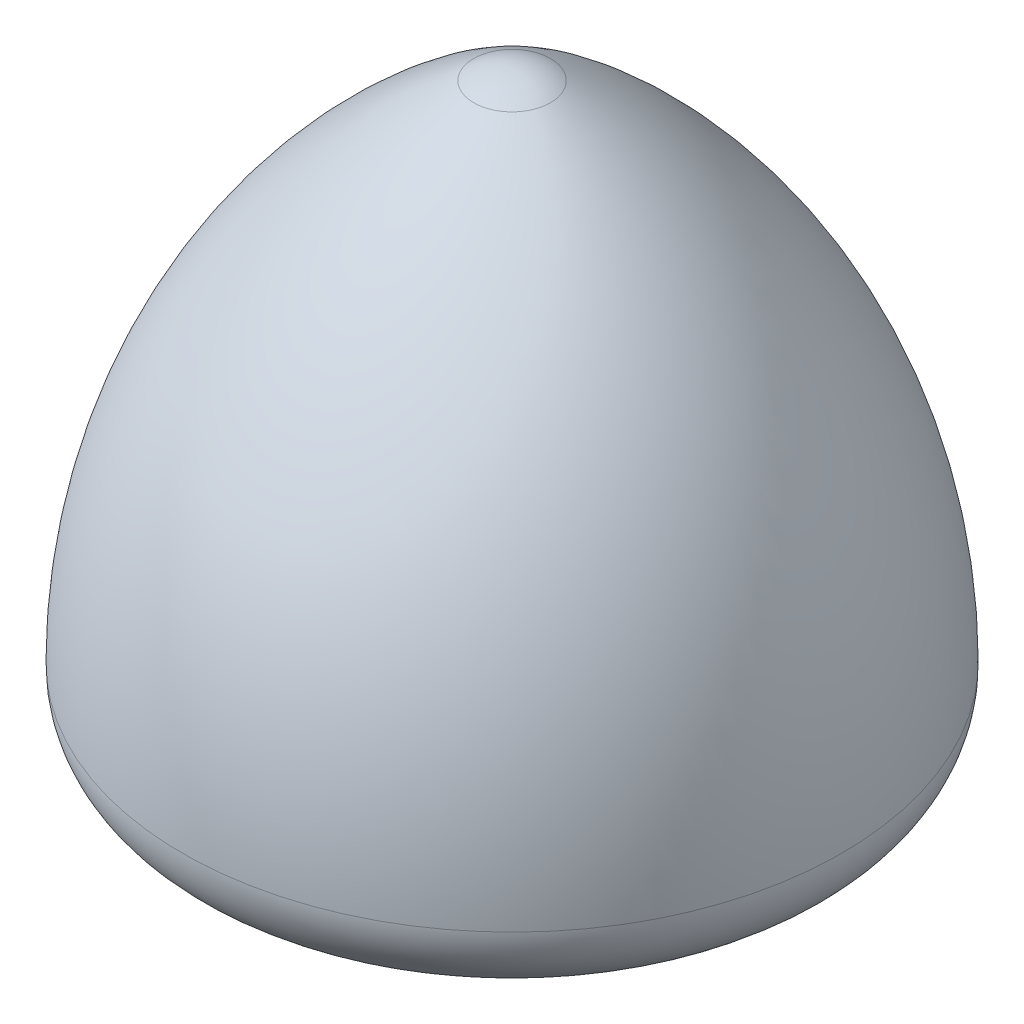
ISO-10303-21;
HEADER;
FILE_DESCRIPTION(('STEP AP214'),'2;1');
FILE_NAME('part.step','',(''),(''),'','','');
FILE_SCHEMA(('AUTOMOTIVE_DESIGN { 1 0 10303 214 1 1 1 1 }'));
ENDSEC;
DATA;
#1=APPLICATION_CONTEXT('core data for automotive mechanical design processes');
#2=APPLICATION_PROTOCOL_DEFINITION('international standard','automotive_design',2000,#1);
#3=PRODUCT_CONTEXT('',#1,'mechanical');
#4=PRODUCT('Part','Part','',(#3));
#5=PRODUCT_RELATED_PRODUCT_CATEGORY('part','',(#4));
#6=PRODUCT_DEFINITION_FORMATION('','',#4);
#7=PRODUCT_DEFINITION_CONTEXT('part definition',#1,'design');
#8=PRODUCT_DEFINITION('design','',#6,#7);
#9=PRODUCT_DEFINITION_SHAPE('','',#8);
#10=(LENGTH_UNIT() NAMED_UNIT(*) SI_UNIT(.MILLI.,.METRE.));
#11=(NAMED_UNIT(*) PLANE_ANGLE_UNIT() SI_UNIT($,.RADIAN.));
#12=(NAMED_UNIT(*) SI_UNIT($,.STERADIAN.) SOLID_ANGLE_UNIT());
#13=UNCERTAINTY_MEASURE_WITH_UNIT(LENGTH_MEASURE(1.E-05),#10,'distance_accuracy_value','');
#14=(GEOMETRIC_REPRESENTATION_CONTEXT(3) GLOBAL_UNCERTAINTY_ASSIGNED_CONTEXT((#13)) GLOBAL_UNIT_ASSIGNED_CONTEXT((#10,
#11,#12)) REPRESENTATION_CONTEXT('',''));
#15=CARTESIAN_POINT('',(0.,0.,0.));
#16=DIRECTION('',(0.,0.,1.));
#17=DIRECTION('',(1.,0.,0.));
#18=AXIS2_PLACEMENT_3D('',#15,#16,#17);
#19=CARTESIAN_POINT('',(0.,10.2490305262905,0.));
#20=DIRECTION('',(0.,-1.,0.));
#21=DIRECTION('',(1.,0.,0.));
#22=AXIS2_PLACEMENT_3D('',#19,#20,#21);
#23=SPHERICAL_SURFACE('',#22,2.90939697174653);
#24=CARTESIAN_POINT('',(0.,12.7686422135165,0.));
#25=DIRECTION('',(0.,-1.,0.));
#26=DIRECTION('',(0.,0.,-1.));
#27=AXIS2_PLACEMENT_3D('',#24,#25,#26);
#28=CIRCLE('',#27,1.45469848587326);
#29=CARTESIAN_POINT('',(0.,12.7686422135165,-1.45469848587326));
#30=VERTEX_POINT('',#29);
#31=EDGE_CURVE('E44',#30,#30,#28,.T.);
#32=ORIENTED_EDGE('',*,*,#31,.F.);
#33=EDGE_LOOP('',(#32));
#34=FACE_BOUND('',#33,.T.);
#35=ADVANCED_FACE('F34',(#34),#23,.T.);
#36=CARTESIAN_POINT('',(0.,10.2490305262905,0.));
#37=DIRECTION('',(0.,-1.,0.));
#38=DIRECTION('',(1.,0.,0.));
#39=AXIS2_PLACEMENT_3D('',#36,#37,#38);
#40=SPHERICAL_SURFACE('',#39,22.0906030282535);
#41=CARTESIAN_POINT('',(0.,-8.88199288109445,0.));
#42=DIRECTION('',(0.,-1.,0.));
#43=DIRECTION('',(0.,0.,-1.));
#44=AXIS2_PLACEMENT_3D('',#41,#42,#43);
#45=CIRCLE('',#44,11.0453015141267);
#46=CARTESIAN_POINT('',(0.,-8.88199288109445,-11.0453015141267));
#47=VERTEX_POINT('',#46);
#48=EDGE_CURVE('E10',#47,#47,#45,.T.);
#49=ORIENTED_EDGE('',*,*,#48,.T.);
#50=EDGE_LOOP('',(#49));
#51=FACE_BOUND('',#50,.T.);
#52=ADVANCED_FACE('F55',(#51),#40,.T.);
#53=CARTESIAN_POINT('',(0.,-6.36238119386844,0.));
#54=DIRECTION('',(0.,-1.,0.));
#55=DIRECTION('',(0.,0.,-1.));
#56=AXIS2_PLACEMENT_3D('',#53,#54,#55);
#57=TOROIDAL_SURFACE('',#56,9.59060302825347,2.90939697174653);
#58=CARTESIAN_POINT('',(0.,-6.36238119386844,0.));
#59=DIRECTION('',(0.,-1.,0.));
#60=DIRECTION('',(0.,0.,-1.));
#61=AXIS2_PLACEMENT_3D('',#58,#59,#60);
#62=CIRCLE('',#61,12.5);
#63=CARTESIAN_POINT('',(0.,-6.36238119386844,-12.5));
#64=VERTEX_POINT('',#63);
#65=EDGE_CURVE('E40',#64,#64,#62,.T.);
#66=ORIENTED_EDGE('',*,*,#65,.T.);
#67=EDGE_LOOP('',(#66));
#68=FACE_BOUND('',#67,.T.);
#69=ORIENTED_EDGE('',*,*,#48,.F.);
#70=EDGE_LOOP('',(#69));
#71=FACE_BOUND('',#70,.T.);
#72=ADVANCED_FACE('F59',(#68,#71),#57,.T.);
#73=CARTESIAN_POINT('',(0.,-6.36238119386844,0.));
#74=DIRECTION('',(0.,-1.,0.));
#75=DIRECTION('',(0.,0.,-1.));
#76=AXIS2_PLACEMENT_3D('',#73,#74,#75);
#77=DEGENERATE_TOROIDAL_SURFACE('',#76,9.59060302825347,22.0906030282535,.F.);
#78=ORIENTED_EDGE('',*,*,#31,.T.);
#79=EDGE_LOOP('',(#78));
#80=FACE_BOUND('',#79,.T.);
#81=ORIENTED_EDGE('',*,*,#65,.F.);
#82=EDGE_LOOP('',(#81));
#83=FACE_BOUND('',#82,.T.);
#84=ADVANCED_FACE('F51',(#80,#83),#77,.F.);
#85=CLOSED_SHELL('',(#35,#52,#72,#84));
#86=MANIFOLD_SOLID_BREP('B2',#85);
#87=ADVANCED_BREP_SHAPE_REPRESENTATION('',(#18,#86),#14);
#88=SHAPE_DEFINITION_REPRESENTATION(#9,#87);
ENDSEC;
END-ISO-10303-21;
